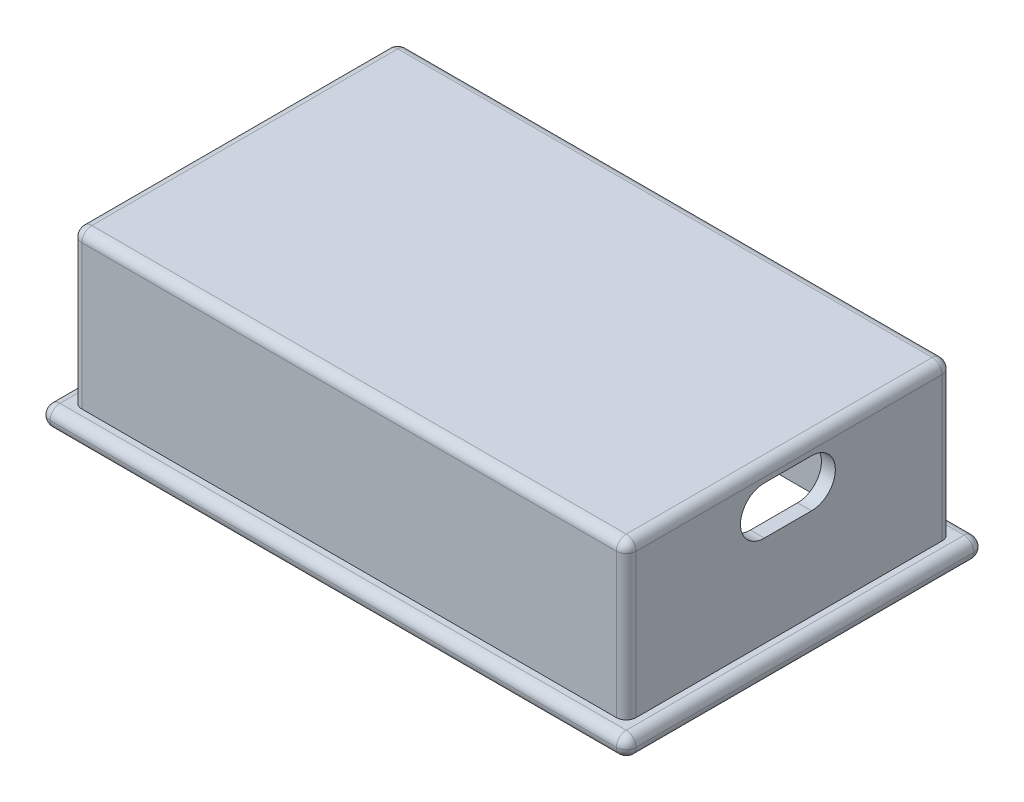
ISO-10303-21;
HEADER;
FILE_DESCRIPTION(('STEP AP214'),'2;1');
FILE_NAME('part.step','',(''),(''),'','','');
FILE_SCHEMA(('AUTOMOTIVE_DESIGN { 1 0 10303 214 1 1 1 1 }'));
ENDSEC;
DATA;
#1=APPLICATION_CONTEXT('core data for automotive mechanical design processes');
#2=APPLICATION_PROTOCOL_DEFINITION('international standard','automotive_design',2000,#1);
#3=PRODUCT_CONTEXT('',#1,'mechanical');
#4=PRODUCT('Part','Part','',(#3));
#5=PRODUCT_RELATED_PRODUCT_CATEGORY('part','',(#4));
#6=PRODUCT_DEFINITION_FORMATION('','',#4);
#7=PRODUCT_DEFINITION_CONTEXT('part definition',#1,'design');
#8=PRODUCT_DEFINITION('design','',#6,#7);
#9=PRODUCT_DEFINITION_SHAPE('','',#8);
#10=(LENGTH_UNIT() NAMED_UNIT(*) SI_UNIT(.MILLI.,.METRE.));
#11=(NAMED_UNIT(*) PLANE_ANGLE_UNIT() SI_UNIT($,.RADIAN.));
#12=(NAMED_UNIT(*) SI_UNIT($,.STERADIAN.) SOLID_ANGLE_UNIT());
#13=UNCERTAINTY_MEASURE_WITH_UNIT(LENGTH_MEASURE(1.E-05),#10,'distance_accuracy_value','');
#14=(GEOMETRIC_REPRESENTATION_CONTEXT(3) GLOBAL_UNCERTAINTY_ASSIGNED_CONTEXT((#13)) GLOBAL_UNIT_ASSIGNED_CONTEXT((#10,
#11,#12)) REPRESENTATION_CONTEXT('',''));
#15=CARTESIAN_POINT('',(0.,0.,0.));
#16=DIRECTION('',(0.,0.,1.));
#17=DIRECTION('',(1.,0.,0.));
#18=AXIS2_PLACEMENT_3D('',#15,#16,#17);
#19=CARTESIAN_POINT('',(0.,0.,0.));
#20=DIRECTION('',(0.,1.,0.));
#21=DIRECTION('',(0.,0.,1.));
#22=AXIS2_PLACEMENT_3D('',#19,#20,#21);
#23=PLANE('',#22);
#24=DIRECTION('',(1.,0.,0.));
#25=VECTOR('',#24,1.);
#26=CARTESIAN_POINT('',(0.,0.,17.));
#27=LINE('',#26,#25);
#28=CARTESIAN_POINT('',(28.5,0.,17.));
#29=VERTEX_POINT('',#28);
#30=CARTESIAN_POINT('',(-28.5,0.,17.));
#31=VERTEX_POINT('',#30);
#32=EDGE_CURVE('E401',#29,#31,#27,.F.);
#33=ORIENTED_EDGE('',*,*,#32,.T.);
#34=DIRECTION('',(0.,0.,1.));
#35=VECTOR('',#34,1.);
#36=CARTESIAN_POINT('',(-28.5,0.,0.));
#37=LINE('',#36,#35);
#38=CARTESIAN_POINT('',(-28.5,0.,-17.));
#39=VERTEX_POINT('',#38);
#40=EDGE_CURVE('E394',#31,#39,#37,.F.);
#41=ORIENTED_EDGE('',*,*,#40,.T.);
#42=DIRECTION('',(-1.,0.,0.));
#43=VECTOR('',#42,1.);
#44=CARTESIAN_POINT('',(0.,0.,-17.));
#45=LINE('',#44,#43);
#46=CARTESIAN_POINT('',(28.5,0.,-17.));
#47=VERTEX_POINT('',#46);
#48=EDGE_CURVE('E397',#39,#47,#45,.F.);
#49=ORIENTED_EDGE('',*,*,#48,.T.);
#50=DIRECTION('',(0.,0.,-1.));
#51=VECTOR('',#50,1.);
#52=CARTESIAN_POINT('',(28.5,0.,0.));
#53=LINE('',#52,#51);
#54=EDGE_CURVE('E399',#47,#29,#53,.F.);
#55=ORIENTED_EDGE('',*,*,#54,.T.);
#56=EDGE_LOOP('',(#33,#41,#49,#55));
#57=FACE_BOUND('',#56,.T.);
#58=DIRECTION('',(1.,0.,0.));
#59=VECTOR('',#58,1.);
#60=CARTESIAN_POINT('',(26.5,0.,-15.));
#61=LINE('',#60,#59);
#62=CARTESIAN_POINT('',(-26.5,0.,-15.));
#63=VERTEX_POINT('',#62);
#64=CARTESIAN_POINT('',(26.5,0.,-15.));
#65=VERTEX_POINT('',#64);
#66=EDGE_CURVE('E420',#63,#65,#61,.T.);
#67=ORIENTED_EDGE('',*,*,#66,.F.);
#68=DIRECTION('',(0.,0.,-1.));
#69=VECTOR('',#68,1.);
#70=CARTESIAN_POINT('',(-26.5,0.,-15.));
#71=LINE('',#70,#69);
#72=CARTESIAN_POINT('',(-26.5,0.,15.));
#73=VERTEX_POINT('',#72);
#74=EDGE_CURVE('E423',#73,#63,#71,.T.);
#75=ORIENTED_EDGE('',*,*,#74,.F.);
#76=DIRECTION('',(-1.,0.,0.));
#77=VECTOR('',#76,1.);
#78=CARTESIAN_POINT('',(26.5,0.,15.));
#79=LINE('',#78,#77);
#80=CARTESIAN_POINT('',(26.5,0.,15.));
#81=VERTEX_POINT('',#80);
#82=EDGE_CURVE('E413',#81,#73,#79,.T.);
#83=ORIENTED_EDGE('',*,*,#82,.F.);
#84=DIRECTION('',(0.,0.,1.));
#85=VECTOR('',#84,1.);
#86=CARTESIAN_POINT('',(26.5,0.,-15.));
#87=LINE('',#86,#85);
#88=EDGE_CURVE('E417',#65,#81,#87,.T.);
#89=ORIENTED_EDGE('',*,*,#88,.F.);
#90=EDGE_LOOP('',(#67,#75,#83,#89));
#91=FACE_BOUND('',#90,.T.);
#92=ADVANCED_FACE('F39',(#57,#91),#23,.F.);
#93=CARTESIAN_POINT('',(-26.5,15.9,-15.));
#94=DIRECTION('',(-1.,0.,0.));
#95=DIRECTION('',(0.,0.,1.));
#96=AXIS2_PLACEMENT_3D('',#93,#94,#95);
#97=PLANE('',#96);
#98=ORIENTED_EDGE('',*,*,#74,.T.);
#99=DIRECTION('',(0.,-1.,0.));
#100=VECTOR('',#99,1.);
#101=CARTESIAN_POINT('',(-26.5,15.9,-15.));
#102=LINE('',#101,#100);
#103=CARTESIAN_POINT('',(-26.5,15.9,-15.));
#104=VERTEX_POINT('',#103);
#105=EDGE_CURVE('E404',#104,#63,#102,.T.);
#106=ORIENTED_EDGE('',*,*,#105,.F.);
#107=DIRECTION('',(0.,0.,-1.));
#108=VECTOR('',#107,1.);
#109=CARTESIAN_POINT('',(-26.5,15.9,-15.));
#110=LINE('',#109,#108);
#111=CARTESIAN_POINT('',(-26.5,15.9,15.));
#112=VERTEX_POINT('',#111);
#113=EDGE_CURVE('E416',#112,#104,#110,.T.);
#114=ORIENTED_EDGE('',*,*,#113,.F.);
#115=DIRECTION('',(0.,-1.,0.));
#116=VECTOR('',#115,1.);
#117=CARTESIAN_POINT('',(-26.5,15.9,15.));
#118=LINE('',#117,#116);
#119=EDGE_CURVE('E403',#112,#73,#118,.T.);
#120=ORIENTED_EDGE('',*,*,#119,.T.);
#121=EDGE_LOOP('',(#98,#106,#114,#120));
#122=FACE_BOUND('',#121,.T.);
#123=ADVANCED_FACE('F561',(#122),#97,.F.);
#124=CARTESIAN_POINT('',(26.5,15.9,15.));
#125=DIRECTION('',(0.,0.,1.));
#126=DIRECTION('',(1.,0.,0.));
#127=AXIS2_PLACEMENT_3D('',#124,#125,#126);
#128=PLANE('',#127);
#129=ORIENTED_EDGE('',*,*,#82,.T.);
#130=ORIENTED_EDGE('',*,*,#119,.F.);
#131=DIRECTION('',(-1.,0.,0.));
#132=VECTOR('',#131,1.);
#133=CARTESIAN_POINT('',(26.5,15.9,15.));
#134=LINE('',#133,#132);
#135=CARTESIAN_POINT('',(26.5,15.9,15.));
#136=VERTEX_POINT('',#135);
#137=EDGE_CURVE('E408',#136,#112,#134,.T.);
#138=ORIENTED_EDGE('',*,*,#137,.F.);
#139=DIRECTION('',(0.,-1.,0.));
#140=VECTOR('',#139,1.);
#141=CARTESIAN_POINT('',(26.5,15.9,15.));
#142=LINE('',#141,#140);
#143=EDGE_CURVE('E410',#136,#81,#142,.T.);
#144=ORIENTED_EDGE('',*,*,#143,.T.);
#145=EDGE_LOOP('',(#129,#130,#138,#144));
#146=FACE_BOUND('',#145,.T.);
#147=ADVANCED_FACE('F567',(#146),#128,.F.);
#148=CARTESIAN_POINT('',(26.5,15.9,-15.));
#149=DIRECTION('',(1.,0.,0.));
#150=DIRECTION('',(0.,0.,-1.));
#151=AXIS2_PLACEMENT_3D('',#148,#149,#150);
#152=PLANE('',#151);
#153=DIRECTION('',(0.,0.,1.));
#154=VECTOR('',#153,1.);
#155=CARTESIAN_POINT('',(26.5,15.9,-15.));
#156=LINE('',#155,#154);
#157=CARTESIAN_POINT('',(26.5,15.9,3.18556546004011));
#158=VERTEX_POINT('',#157);
#159=EDGE_CURVE('E432',#158,#136,#156,.T.);
#160=ORIENTED_EDGE('',*,*,#159,.F.);
#161=CARTESIAN_POINT('',(26.5,13.6,2.5));
#162=DIRECTION('',(1.,0.,0.));
#163=DIRECTION('',(0.,0.,-1.));
#164=AXIS2_PLACEMENT_3D('',#161,#162,#163);
#165=CIRCLE('',#164,2.4);
#166=CARTESIAN_POINT('',(26.5,11.2,2.49999999999998));
#167=VERTEX_POINT('',#166);
#168=EDGE_CURVE('E449',#167,#158,#165,.F.);
#169=ORIENTED_EDGE('',*,*,#168,.F.);
#170=DIRECTION('',(0.,0.,1.));
#171=VECTOR('',#170,1.);
#172=CARTESIAN_POINT('',(26.5,11.2,-2.25000000000003));
#173=LINE('',#172,#171);
#174=CARTESIAN_POINT('',(26.5,11.2,-2.25000000000003));
#175=VERTEX_POINT('',#174);
#176=EDGE_CURVE('E447',#175,#167,#173,.T.);
#177=ORIENTED_EDGE('',*,*,#176,.F.);
#178=CARTESIAN_POINT('',(26.5,13.6,-2.25));
#179=DIRECTION('',(1.,0.,0.));
#180=DIRECTION('',(0.,0.,-1.));
#181=AXIS2_PLACEMENT_3D('',#178,#179,#180);
#182=CIRCLE('',#181,2.4);
#183=CARTESIAN_POINT('',(26.5,15.9,-2.9355654600401));
#184=VERTEX_POINT('',#183);
#185=EDGE_CURVE('E459',#184,#175,#182,.F.);
#186=ORIENTED_EDGE('',*,*,#185,.F.);
#187=CARTESIAN_POINT('',(26.5,15.9,-15.));
#188=VERTEX_POINT('',#187);
#189=EDGE_CURVE('E428',#188,#184,#156,.T.);
#190=ORIENTED_EDGE('',*,*,#189,.F.);
#191=DIRECTION('',(0.,-1.,0.));
#192=VECTOR('',#191,1.);
#193=CARTESIAN_POINT('',(26.5,15.9,-15.));
#194=LINE('',#193,#192);
#195=EDGE_CURVE('E407',#188,#65,#194,.T.);
#196=ORIENTED_EDGE('',*,*,#195,.T.);
#197=ORIENTED_EDGE('',*,*,#88,.T.);
#198=ORIENTED_EDGE('',*,*,#143,.F.);
#199=EDGE_LOOP('',(#160,#169,#177,#186,#190,#196,#197,#198));
#200=FACE_BOUND('',#199,.T.);
#201=ADVANCED_FACE('F487',(#200),#152,.F.);
#202=CARTESIAN_POINT('',(26.5,15.9,-15.));
#203=DIRECTION('',(0.,0.,-1.));
#204=DIRECTION('',(-1.,0.,0.));
#205=AXIS2_PLACEMENT_3D('',#202,#203,#204);
#206=PLANE('',#205);
#207=ORIENTED_EDGE('',*,*,#66,.T.);
#208=ORIENTED_EDGE('',*,*,#195,.F.);
#209=DIRECTION('',(1.,0.,0.));
#210=VECTOR('',#209,1.);
#211=CARTESIAN_POINT('',(26.5,15.9,-15.));
#212=LINE('',#211,#210);
#213=EDGE_CURVE('E433',#104,#188,#212,.T.);
#214=ORIENTED_EDGE('',*,*,#213,.F.);
#215=ORIENTED_EDGE('',*,*,#105,.T.);
#216=EDGE_LOOP('',(#207,#208,#214,#215));
#217=FACE_BOUND('',#216,.T.);
#218=ADVANCED_FACE('F881',(#217),#206,.F.);
#219=CARTESIAN_POINT('',(0.,15.9,0.));
#220=DIRECTION('',(0.,-1.,0.));
#221=DIRECTION('',(0.,0.,-1.));
#222=AXIS2_PLACEMENT_3D('',#219,#220,#221);
#223=PLANE('',#222);
#224=ORIENTED_EDGE('',*,*,#113,.T.);
#225=ORIENTED_EDGE('',*,*,#213,.T.);
#226=ORIENTED_EDGE('',*,*,#189,.T.);
#227=EDGE_CURVE('E431',#184,#158,#156,.T.);
#228=ORIENTED_EDGE('',*,*,#227,.T.);
#229=ORIENTED_EDGE('',*,*,#159,.T.);
#230=ORIENTED_EDGE('',*,*,#137,.T.);
#231=EDGE_LOOP('',(#224,#225,#226,#228,#229,#230));
#232=FACE_BOUND('',#231,.T.);
#233=ADVANCED_FACE('F868',(#232),#223,.T.);
#234=CARTESIAN_POINT('',(0.,2.,0.));
#235=DIRECTION('',(0.,1.,0.));
#236=DIRECTION('',(0.,0.,1.));
#237=AXIS2_PLACEMENT_3D('',#234,#235,#236);
#238=PLANE('',#237);
#239=DIRECTION('',(-1.,0.,0.));
#240=VECTOR('',#239,1.);
#241=CARTESIAN_POINT('',(-29.5,2.,-17.));
#242=LINE('',#241,#240);
#243=CARTESIAN_POINT('',(28.5,2.,-17.));
#244=VERTEX_POINT('',#243);
#245=CARTESIAN_POINT('',(-28.5,2.,-17.));
#246=VERTEX_POINT('',#245);
#247=EDGE_CURVE('E388',#244,#246,#242,.T.);
#248=ORIENTED_EDGE('',*,*,#247,.T.);
#249=DIRECTION('',(0.,0.,1.));
#250=VECTOR('',#249,1.);
#251=CARTESIAN_POINT('',(-28.5,2.,18.));
#252=LINE('',#251,#250);
#253=CARTESIAN_POINT('',(-28.5,2.,17.));
#254=VERTEX_POINT('',#253);
#255=EDGE_CURVE('E385',#246,#254,#252,.T.);
#256=ORIENTED_EDGE('',*,*,#255,.T.);
#257=DIRECTION('',(1.,0.,0.));
#258=VECTOR('',#257,1.);
#259=CARTESIAN_POINT('',(29.5,2.,17.));
#260=LINE('',#259,#258);
#261=CARTESIAN_POINT('',(28.5,2.,17.));
#262=VERTEX_POINT('',#261);
#263=EDGE_CURVE('E392',#254,#262,#260,.T.);
#264=ORIENTED_EDGE('',*,*,#263,.T.);
#265=DIRECTION('',(0.,0.,-1.));
#266=VECTOR('',#265,1.);
#267=CARTESIAN_POINT('',(28.5,2.,-18.));
#268=LINE('',#267,#266);
#269=EDGE_CURVE('E390',#262,#244,#268,.T.);
#270=ORIENTED_EDGE('',*,*,#269,.T.);
#271=EDGE_LOOP('',(#248,#256,#264,#270));
#272=FACE_BOUND('',#271,.T.);
#273=DIRECTION('',(-1.,0.,0.));
#274=VECTOR('',#273,1.);
#275=CARTESIAN_POINT('',(27.9,2.,-16.4));
#276=LINE('',#275,#274);
#277=CARTESIAN_POINT('',(26.9,2.,-16.4));
#278=VERTEX_POINT('',#277);
#279=CARTESIAN_POINT('',(-26.9,2.,-16.4));
#280=VERTEX_POINT('',#279);
#281=EDGE_CURVE('E425',#278,#280,#276,.T.);
#282=ORIENTED_EDGE('',*,*,#281,.F.);
#283=CARTESIAN_POINT('',(26.9,2.,-15.4));
#284=DIRECTION('',(0.,1.,0.));
#285=DIRECTION('',(0.,0.,1.));
#286=AXIS2_PLACEMENT_3D('',#283,#284,#285);
#287=CIRCLE('',#286,1.);
#288=CARTESIAN_POINT('',(27.9,2.,-15.4));
#289=VERTEX_POINT('',#288);
#290=EDGE_CURVE('E357',#278,#289,#287,.F.);
#291=ORIENTED_EDGE('',*,*,#290,.T.);
#292=DIRECTION('',(0.,0.,-1.));
#293=VECTOR('',#292,1.);
#294=CARTESIAN_POINT('',(27.9,2.,16.4));
#295=LINE('',#294,#293);
#296=CARTESIAN_POINT('',(27.9,2.,15.4));
#297=VERTEX_POINT('',#296);
#298=EDGE_CURVE('E440',#297,#289,#295,.T.);
#299=ORIENTED_EDGE('',*,*,#298,.F.);
#300=CARTESIAN_POINT('',(26.9,2.,15.4));
#301=DIRECTION('',(0.,1.,0.));
#302=DIRECTION('',(0.,0.,1.));
#303=AXIS2_PLACEMENT_3D('',#300,#301,#302);
#304=CIRCLE('',#303,1.);
#305=CARTESIAN_POINT('',(26.9,2.,16.4));
#306=VERTEX_POINT('',#305);
#307=EDGE_CURVE('E355',#297,#306,#304,.F.);
#308=ORIENTED_EDGE('',*,*,#307,.T.);
#309=DIRECTION('',(1.,0.,0.));
#310=VECTOR('',#309,1.);
#311=CARTESIAN_POINT('',(27.9,2.,16.4));
#312=LINE('',#311,#310);
#313=CARTESIAN_POINT('',(-26.9,2.,16.4));
#314=VERTEX_POINT('',#313);
#315=EDGE_CURVE('E237',#314,#306,#312,.T.);
#316=ORIENTED_EDGE('',*,*,#315,.F.);
#317=CARTESIAN_POINT('',(-26.9,2.,15.4));
#318=DIRECTION('',(0.,1.,0.));
#319=DIRECTION('',(0.,0.,1.));
#320=AXIS2_PLACEMENT_3D('',#317,#318,#319);
#321=CIRCLE('',#320,1.);
#322=CARTESIAN_POINT('',(-27.9,2.,15.4));
#323=VERTEX_POINT('',#322);
#324=EDGE_CURVE('E12',#314,#323,#321,.F.);
#325=ORIENTED_EDGE('',*,*,#324,.T.);
#326=DIRECTION('',(0.,0.,1.));
#327=VECTOR('',#326,1.);
#328=CARTESIAN_POINT('',(-27.9,2.,16.4));
#329=LINE('',#328,#327);
#330=CARTESIAN_POINT('',(-27.9,2.,-15.4));
#331=VERTEX_POINT('',#330);
#332=EDGE_CURVE('E444',#331,#323,#329,.T.);
#333=ORIENTED_EDGE('',*,*,#332,.F.);
#334=CARTESIAN_POINT('',(-26.9,2.,-15.4));
#335=DIRECTION('',(0.,1.,0.));
#336=DIRECTION('',(0.,0.,1.));
#337=AXIS2_PLACEMENT_3D('',#334,#335,#336);
#338=CIRCLE('',#337,1.);
#339=EDGE_CURVE('E49',#331,#280,#338,.F.);
#340=ORIENTED_EDGE('',*,*,#339,.T.);
#341=EDGE_LOOP('',(#282,#291,#299,#308,#316,#325,#333,#340));
#342=FACE_BOUND('',#341,.T.);
#343=ADVANCED_FACE('F546',(#272,#342),#238,.T.);
#344=CARTESIAN_POINT('',(-27.9,2.,16.4));
#345=DIRECTION('',(-1.,0.,0.));
#346=DIRECTION('',(0.,0.,1.));
#347=AXIS2_PLACEMENT_3D('',#344,#345,#346);
#348=PLANE('',#347);
#349=DIRECTION('',(0.,0.,1.));
#350=VECTOR('',#349,1.);
#351=CARTESIAN_POINT('',(-27.9,16.5,16.4));
#352=LINE('',#351,#350);
#353=CARTESIAN_POINT('',(-27.9,16.5,15.4));
#354=VERTEX_POINT('',#353);
#355=CARTESIAN_POINT('',(-27.9,16.5,-15.4));
#356=VERTEX_POINT('',#355);
#357=EDGE_CURVE('E58',#354,#356,#352,.F.);
#358=ORIENTED_EDGE('',*,*,#357,.T.);
#359=DIRECTION('',(0.,1.,0.));
#360=VECTOR('',#359,1.);
#361=CARTESIAN_POINT('',(-27.9,2.,-15.4));
#362=LINE('',#361,#360);
#363=EDGE_CURVE('E359',#356,#331,#362,.F.);
#364=ORIENTED_EDGE('',*,*,#363,.T.);
#365=ORIENTED_EDGE('',*,*,#332,.T.);
#366=DIRECTION('',(0.,1.,0.));
#367=VECTOR('',#366,1.);
#368=CARTESIAN_POINT('',(-27.9,2.,15.4));
#369=LINE('',#368,#367);
#370=EDGE_CURVE('E241',#323,#354,#369,.T.);
#371=ORIENTED_EDGE('',*,*,#370,.T.);
#372=EDGE_LOOP('',(#358,#364,#365,#371));
#373=FACE_BOUND('',#372,.T.);
#374=ADVANCED_FACE('F550',(#373),#348,.T.);
#375=CARTESIAN_POINT('',(27.9,2.,-16.4));
#376=DIRECTION('',(0.,0.,-1.));
#377=DIRECTION('',(-1.,0.,0.));
#378=AXIS2_PLACEMENT_3D('',#375,#376,#377);
#379=PLANE('',#378);
#380=DIRECTION('',(-1.,0.,0.));
#381=VECTOR('',#380,1.);
#382=CARTESIAN_POINT('',(27.9,16.5,-16.4));
#383=LINE('',#382,#381);
#384=CARTESIAN_POINT('',(-26.9,16.5,-16.4));
#385=VERTEX_POINT('',#384);
#386=CARTESIAN_POINT('',(26.9,16.5,-16.4));
#387=VERTEX_POINT('',#386);
#388=EDGE_CURVE('E371',#385,#387,#383,.F.);
#389=ORIENTED_EDGE('',*,*,#388,.T.);
#390=DIRECTION('',(0.,1.,0.));
#391=VECTOR('',#390,1.);
#392=CARTESIAN_POINT('',(26.9,2.,-16.4));
#393=LINE('',#392,#391);
#394=EDGE_CURVE('E369',#387,#278,#393,.F.);
#395=ORIENTED_EDGE('',*,*,#394,.T.);
#396=ORIENTED_EDGE('',*,*,#281,.T.);
#397=DIRECTION('',(0.,1.,0.));
#398=VECTOR('',#397,1.);
#399=CARTESIAN_POINT('',(-26.9,2.,-16.4));
#400=LINE('',#399,#398);
#401=EDGE_CURVE('E374',#280,#385,#400,.T.);
#402=ORIENTED_EDGE('',*,*,#401,.T.);
#403=EDGE_LOOP('',(#389,#395,#396,#402));
#404=FACE_BOUND('',#403,.T.);
#405=ADVANCED_FACE('F505',(#404),#379,.T.);
#406=CARTESIAN_POINT('',(27.9,2.,16.4));
#407=DIRECTION('',(1.,0.,0.));
#408=DIRECTION('',(0.,0.,-1.));
#409=AXIS2_PLACEMENT_3D('',#406,#407,#408);
#410=PLANE('',#409);
#411=CARTESIAN_POINT('',(27.9,13.6,2.5));
#412=DIRECTION('',(1.,0.,0.));
#413=DIRECTION('',(0.,0.,-1.));
#414=AXIS2_PLACEMENT_3D('',#411,#412,#413);
#415=CIRCLE('',#414,2.4);
#416=CARTESIAN_POINT('',(27.9,16.,2.5));
#417=VERTEX_POINT('',#416);
#418=CARTESIAN_POINT('',(27.9,11.2,2.49999999999998));
#419=VERTEX_POINT('',#418);
#420=EDGE_CURVE('E292',#417,#419,#415,.T.);
#421=ORIENTED_EDGE('',*,*,#420,.F.);
#422=DIRECTION('',(0.,0.,1.));
#423=VECTOR('',#422,1.);
#424=CARTESIAN_POINT('',(27.9,16.,-2.25));
#425=LINE('',#424,#423);
#426=CARTESIAN_POINT('',(27.9,16.,-2.25));
#427=VERTEX_POINT('',#426);
#428=EDGE_CURVE('E453',#427,#417,#425,.T.);
#429=ORIENTED_EDGE('',*,*,#428,.F.);
#430=CARTESIAN_POINT('',(27.9,13.6,-2.25));
#431=DIRECTION('',(1.,0.,0.));
#432=DIRECTION('',(0.,0.,-1.));
#433=AXIS2_PLACEMENT_3D('',#430,#431,#432);
#434=CIRCLE('',#433,2.4);
#435=CARTESIAN_POINT('',(27.9,11.2,-2.25000000000003));
#436=VERTEX_POINT('',#435);
#437=EDGE_CURVE('E462',#436,#427,#434,.T.);
#438=ORIENTED_EDGE('',*,*,#437,.F.);
#439=DIRECTION('',(0.,0.,-1.));
#440=VECTOR('',#439,1.);
#441=CARTESIAN_POINT('',(27.9,11.2,-2.25000000000003));
#442=LINE('',#441,#440);
#443=EDGE_CURVE('E464',#419,#436,#442,.T.);
#444=ORIENTED_EDGE('',*,*,#443,.F.);
#445=EDGE_LOOP('',(#421,#429,#438,#444));
#446=FACE_BOUND('',#445,.T.);
#447=ORIENTED_EDGE('',*,*,#298,.T.);
#448=DIRECTION('',(0.,1.,0.));
#449=VECTOR('',#448,1.);
#450=CARTESIAN_POINT('',(27.9,2.,-15.4));
#451=LINE('',#450,#449);
#452=CARTESIAN_POINT('',(27.9,16.5,-15.4));
#453=VERTEX_POINT('',#452);
#454=EDGE_CURVE('E364',#289,#453,#451,.T.);
#455=ORIENTED_EDGE('',*,*,#454,.T.);
#456=DIRECTION('',(0.,0.,-1.));
#457=VECTOR('',#456,1.);
#458=CARTESIAN_POINT('',(27.9,16.5,16.4));
#459=LINE('',#458,#457);
#460=CARTESIAN_POINT('',(27.9,16.5,15.4));
#461=VERTEX_POINT('',#460);
#462=EDGE_CURVE('E366',#453,#461,#459,.F.);
#463=ORIENTED_EDGE('',*,*,#462,.T.);
#464=DIRECTION('',(0.,1.,0.));
#465=VECTOR('',#464,1.);
#466=CARTESIAN_POINT('',(27.9,2.,15.4));
#467=LINE('',#466,#465);
#468=EDGE_CURVE('E258',#461,#297,#467,.F.);
#469=ORIENTED_EDGE('',*,*,#468,.T.);
#470=EDGE_LOOP('',(#447,#455,#463,#469));
#471=FACE_BOUND('',#470,.T.);
#472=ADVANCED_FACE('F502',(#446,#471),#410,.T.);
#473=CARTESIAN_POINT('',(27.9,2.,16.4));
#474=DIRECTION('',(0.,0.,1.));
#475=DIRECTION('',(1.,0.,0.));
#476=AXIS2_PLACEMENT_3D('',#473,#474,#475);
#477=PLANE('',#476);
#478=ORIENTED_EDGE('',*,*,#315,.T.);
#479=DIRECTION('',(0.,1.,0.));
#480=VECTOR('',#479,1.);
#481=CARTESIAN_POINT('',(26.9,2.,16.4));
#482=LINE('',#481,#480);
#483=CARTESIAN_POINT('',(26.9,16.5,16.4));
#484=VERTEX_POINT('',#483);
#485=EDGE_CURVE('E231',#306,#484,#482,.T.);
#486=ORIENTED_EDGE('',*,*,#485,.T.);
#487=DIRECTION('',(1.,0.,0.));
#488=VECTOR('',#487,1.);
#489=CARTESIAN_POINT('',(27.9,16.5,16.4));
#490=LINE('',#489,#488);
#491=CARTESIAN_POINT('',(-26.9,16.5,16.4));
#492=VERTEX_POINT('',#491);
#493=EDGE_CURVE('E234',#484,#492,#490,.F.);
#494=ORIENTED_EDGE('',*,*,#493,.T.);
#495=DIRECTION('',(0.,1.,0.));
#496=VECTOR('',#495,1.);
#497=CARTESIAN_POINT('',(-26.9,2.,16.4));
#498=LINE('',#497,#496);
#499=EDGE_CURVE('E254',#492,#314,#498,.F.);
#500=ORIENTED_EDGE('',*,*,#499,.T.);
#501=EDGE_LOOP('',(#478,#486,#494,#500));
#502=FACE_BOUND('',#501,.T.);
#503=ADVANCED_FACE('F233',(#502),#477,.T.);
#504=CARTESIAN_POINT('',(0.,17.5,0.));
#505=DIRECTION('',(0.,1.,0.));
#506=DIRECTION('',(0.,0.,1.));
#507=AXIS2_PLACEMENT_3D('',#504,#505,#506);
#508=PLANE('',#507);
#509=DIRECTION('',(0.,0.,-1.));
#510=VECTOR('',#509,1.);
#511=CARTESIAN_POINT('',(26.9,17.5,0.));
#512=LINE('',#511,#510);
#513=CARTESIAN_POINT('',(26.9,17.5,15.4));
#514=VERTEX_POINT('',#513);
#515=CARTESIAN_POINT('',(26.9,17.5,-15.4));
#516=VERTEX_POINT('',#515);
#517=EDGE_CURVE('E379',#514,#516,#512,.T.);
#518=ORIENTED_EDGE('',*,*,#517,.T.);
#519=DIRECTION('',(-1.,0.,0.));
#520=VECTOR('',#519,1.);
#521=CARTESIAN_POINT('',(0.,17.5,-15.4));
#522=LINE('',#521,#520);
#523=CARTESIAN_POINT('',(-26.9,17.5,-15.4));
#524=VERTEX_POINT('',#523);
#525=EDGE_CURVE('E376',#516,#524,#522,.T.);
#526=ORIENTED_EDGE('',*,*,#525,.T.);
#527=DIRECTION('',(0.,0.,1.));
#528=VECTOR('',#527,1.);
#529=CARTESIAN_POINT('',(-26.9,17.5,0.));
#530=LINE('',#529,#528);
#531=CARTESIAN_POINT('',(-26.9,17.5,15.4));
#532=VERTEX_POINT('',#531);
#533=EDGE_CURVE('E383',#524,#532,#530,.T.);
#534=ORIENTED_EDGE('',*,*,#533,.T.);
#535=DIRECTION('',(1.,0.,0.));
#536=VECTOR('',#535,1.);
#537=CARTESIAN_POINT('',(0.,17.5,15.4));
#538=LINE('',#537,#536);
#539=EDGE_CURVE('E381',#532,#514,#538,.T.);
#540=ORIENTED_EDGE('',*,*,#539,.T.);
#541=EDGE_LOOP('',(#518,#526,#534,#540));
#542=FACE_BOUND('',#541,.T.);
#543=ADVANCED_FACE('F524',(#542),#508,.T.);
#544=CARTESIAN_POINT('',(15.8115716777442,13.6,2.5));
#545=DIRECTION('',(1.,0.,0.));
#546=DIRECTION('',(0.,0.,-1.));
#547=AXIS2_PLACEMENT_3D('',#544,#545,#546);
#548=CYLINDRICAL_SURFACE('',#547,2.4);
#549=ORIENTED_EDGE('',*,*,#168,.T.);
#550=CARTESIAN_POINT('',(26.5,16.,2.50000000000001));
#551=VERTEX_POINT('',#550);
#552=EDGE_CURVE('E468',#158,#551,#165,.F.);
#553=ORIENTED_EDGE('',*,*,#552,.T.);
#554=DIRECTION('',(1.,0.,0.));
#555=VECTOR('',#554,1.);
#556=CARTESIAN_POINT('',(15.8115716777442,16.,2.5));
#557=LINE('',#556,#555);
#558=EDGE_CURVE('E457',#551,#417,#557,.T.);
#559=ORIENTED_EDGE('',*,*,#558,.T.);
#560=ORIENTED_EDGE('',*,*,#420,.T.);
#561=DIRECTION('',(1.,0.,0.));
#562=VECTOR('',#561,1.);
#563=CARTESIAN_POINT('',(15.8115716777442,11.2,2.49999999999998));
#564=LINE('',#563,#562);
#565=EDGE_CURVE('E450',#167,#419,#564,.T.);
#566=ORIENTED_EDGE('',*,*,#565,.F.);
#567=EDGE_LOOP('',(#549,#553,#559,#560,#566));
#568=FACE_BOUND('',#567,.T.);
#569=ADVANCED_FACE('F492',(#568),#548,.F.);
#570=CARTESIAN_POINT('',(15.8115716777442,16.,-2.25));
#571=DIRECTION('',(0.,1.,0.));
#572=DIRECTION('',(0.,0.,1.));
#573=AXIS2_PLACEMENT_3D('',#570,#571,#572);
#574=PLANE('',#573);
#575=DIRECTION('',(0.,0.,-1.));
#576=VECTOR('',#575,1.);
#577=CARTESIAN_POINT('',(26.5,16.,-2.25));
#578=LINE('',#577,#576);
#579=CARTESIAN_POINT('',(26.5,16.,-2.25));
#580=VERTEX_POINT('',#579);
#581=EDGE_CURVE('E469',#551,#580,#578,.T.);
#582=ORIENTED_EDGE('',*,*,#581,.T.);
#583=DIRECTION('',(1.,0.,0.));
#584=VECTOR('',#583,1.);
#585=CARTESIAN_POINT('',(15.8115716777442,16.,-2.25));
#586=LINE('',#585,#584);
#587=EDGE_CURVE('E455',#580,#427,#586,.T.);
#588=ORIENTED_EDGE('',*,*,#587,.T.);
#589=ORIENTED_EDGE('',*,*,#428,.T.);
#590=ORIENTED_EDGE('',*,*,#558,.F.);
#591=EDGE_LOOP('',(#582,#588,#589,#590));
#592=FACE_BOUND('',#591,.T.);
#593=ADVANCED_FACE('F498',(#592),#574,.F.);
#594=CARTESIAN_POINT('',(15.8115716777442,13.6,-2.25));
#595=DIRECTION('',(1.,0.,0.));
#596=DIRECTION('',(0.,0.,-1.));
#597=AXIS2_PLACEMENT_3D('',#594,#595,#596);
#598=CYLINDRICAL_SURFACE('',#597,2.4);
#599=EDGE_CURVE('E471',#580,#184,#182,.F.);
#600=ORIENTED_EDGE('',*,*,#599,.T.);
#601=ORIENTED_EDGE('',*,*,#185,.T.);
#602=DIRECTION('',(1.,0.,0.));
#603=VECTOR('',#602,1.);
#604=CARTESIAN_POINT('',(15.8115716777442,11.2,-2.25000000000003));
#605=LINE('',#604,#603);
#606=EDGE_CURVE('E103',#175,#436,#605,.T.);
#607=ORIENTED_EDGE('',*,*,#606,.T.);
#608=ORIENTED_EDGE('',*,*,#437,.T.);
#609=ORIENTED_EDGE('',*,*,#587,.F.);
#610=EDGE_LOOP('',(#600,#601,#607,#608,#609));
#611=FACE_BOUND('',#610,.T.);
#612=ADVANCED_FACE('F476',(#611),#598,.F.);
#613=CARTESIAN_POINT('',(15.8115716777442,11.2,-2.25000000000003));
#614=DIRECTION('',(0.,-1.,0.));
#615=DIRECTION('',(0.,0.,-1.));
#616=AXIS2_PLACEMENT_3D('',#613,#614,#615);
#617=PLANE('',#616);
#618=ORIENTED_EDGE('',*,*,#176,.T.);
#619=ORIENTED_EDGE('',*,*,#565,.T.);
#620=ORIENTED_EDGE('',*,*,#443,.T.);
#621=ORIENTED_EDGE('',*,*,#606,.F.);
#622=EDGE_LOOP('',(#618,#619,#620,#621));
#623=FACE_BOUND('',#622,.T.);
#624=ADVANCED_FACE('F481',(#623),#617,.F.);
#625=CARTESIAN_POINT('',(26.5,15.9,-15.));
#626=DIRECTION('',(1.,0.,0.));
#627=DIRECTION('',(0.,0.,-1.));
#628=AXIS2_PLACEMENT_3D('',#625,#626,#627);
#629=PLANE('',#628);
#630=ORIENTED_EDGE('',*,*,#599,.F.);
#631=ORIENTED_EDGE('',*,*,#581,.F.);
#632=ORIENTED_EDGE('',*,*,#552,.F.);
#633=ORIENTED_EDGE('',*,*,#227,.F.);
#634=EDGE_LOOP('',(#630,#631,#632,#633));
#635=FACE_BOUND('',#634,.T.);
#636=ADVANCED_FACE('F495',(#635),#629,.T.);
#637=CARTESIAN_POINT('',(28.5,1.,0.));
#638=DIRECTION('',(0.,0.,1.));
#639=DIRECTION('',(1.,0.,0.));
#640=AXIS2_PLACEMENT_3D('',#637,#638,#639);
#641=CYLINDRICAL_SURFACE('',#640,1.);
#642=DIRECTION('',(0.,0.,-1.));
#643=VECTOR('',#642,1.);
#644=CARTESIAN_POINT('',(29.5,1.,18.));
#645=LINE('',#644,#643);
#646=CARTESIAN_POINT('',(29.5,1.,-17.));
#647=VERTEX_POINT('',#646);
#648=CARTESIAN_POINT('',(29.5,1.,17.));
#649=VERTEX_POINT('',#648);
#650=EDGE_CURVE('E297',#647,#649,#645,.F.);
#651=ORIENTED_EDGE('',*,*,#650,.F.);
#652=CARTESIAN_POINT('',(28.5,1.,-17.));
#653=DIRECTION('',(0.,0.,-1.));
#654=DIRECTION('',(-1.,0.,0.));
#655=AXIS2_PLACEMENT_3D('',#652,#653,#654);
#656=CIRCLE('',#655,1.);
#657=EDGE_CURVE('E289',#244,#647,#656,.T.);
#658=ORIENTED_EDGE('',*,*,#657,.F.);
#659=ORIENTED_EDGE('',*,*,#269,.F.);
#660=CARTESIAN_POINT('',(28.5,1.,17.));
#661=DIRECTION('',(0.,0.,1.));
#662=DIRECTION('',(1.,0.,0.));
#663=AXIS2_PLACEMENT_3D('',#660,#661,#662);
#664=CIRCLE('',#663,1.);
#665=EDGE_CURVE('E87',#649,#262,#664,.T.);
#666=ORIENTED_EDGE('',*,*,#665,.F.);
#667=EDGE_LOOP('',(#651,#658,#659,#666));
#668=FACE_BOUND('',#667,.T.);
#669=ADVANCED_FACE('F631',(#668),#641,.T.);
#670=CARTESIAN_POINT('',(28.5,1.,-17.));
#671=DIRECTION('',(1.,0.,0.));
#672=DIRECTION('',(0.,0.,-1.));
#673=AXIS2_PLACEMENT_3D('',#670,#671,#672);
#674=SPHERICAL_SURFACE('',#673,1.);
#675=ORIENTED_EDGE('',*,*,#657,.T.);
#676=CARTESIAN_POINT('',(28.5,1.,-17.));
#677=DIRECTION('',(0.,-1.,0.));
#678=DIRECTION('',(0.,0.,-1.));
#679=AXIS2_PLACEMENT_3D('',#676,#677,#678);
#680=CIRCLE('',#679,1.);
#681=CARTESIAN_POINT('',(28.5,1.,-18.));
#682=VERTEX_POINT('',#681);
#683=EDGE_CURVE('E94',#682,#647,#680,.T.);
#684=ORIENTED_EDGE('',*,*,#683,.F.);
#685=CARTESIAN_POINT('',(28.5,1.,-17.));
#686=DIRECTION('',(1.,0.,0.));
#687=DIRECTION('',(0.,0.,-1.));
#688=AXIS2_PLACEMENT_3D('',#685,#686,#687);
#689=CIRCLE('',#688,1.);
#690=EDGE_CURVE('E303',#244,#682,#689,.F.);
#691=ORIENTED_EDGE('',*,*,#690,.F.);
#692=EDGE_LOOP('',(#675,#684,#691));
#693=FACE_BOUND('',#692,.T.);
#694=ADVANCED_FACE('F627',(#693),#674,.T.);
#695=CARTESIAN_POINT('',(28.5,1.,17.));
#696=DIRECTION('',(1.,0.,0.));
#697=DIRECTION('',(0.,0.,-1.));
#698=AXIS2_PLACEMENT_3D('',#695,#696,#697);
#699=SPHERICAL_SURFACE('',#698,1.);
#700=CARTESIAN_POINT('',(28.5,1.,17.));
#701=DIRECTION('',(0.,1.,0.));
#702=DIRECTION('',(0.,0.,1.));
#703=AXIS2_PLACEMENT_3D('',#700,#701,#702);
#704=CIRCLE('',#703,1.);
#705=CARTESIAN_POINT('',(28.5,1.,18.));
#706=VERTEX_POINT('',#705);
#707=EDGE_CURVE('E294',#649,#706,#704,.F.);
#708=ORIENTED_EDGE('',*,*,#707,.F.);
#709=ORIENTED_EDGE('',*,*,#665,.T.);
#710=CARTESIAN_POINT('',(28.5,1.,17.));
#711=DIRECTION('',(1.,0.,0.));
#712=DIRECTION('',(0.,0.,-1.));
#713=AXIS2_PLACEMENT_3D('',#710,#711,#712);
#714=CIRCLE('',#713,1.);
#715=EDGE_CURVE('E306',#706,#262,#714,.F.);
#716=ORIENTED_EDGE('',*,*,#715,.F.);
#717=EDGE_LOOP('',(#708,#709,#716));
#718=FACE_BOUND('',#717,.T.);
#719=ADVANCED_FACE('F623',(#718),#699,.T.);
#720=CARTESIAN_POINT('',(28.5,1.,18.));
#721=DIRECTION('',(0.,0.,-1.));
#722=DIRECTION('',(-1.,0.,0.));
#723=AXIS2_PLACEMENT_3D('',#720,#721,#722);
#724=CYLINDRICAL_SURFACE('',#723,1.);
#725=CARTESIAN_POINT('',(28.5,1.,-17.));
#726=DIRECTION('',(0.,0.,-1.));
#727=DIRECTION('',(-1.,0.,0.));
#728=AXIS2_PLACEMENT_3D('',#725,#726,#727);
#729=CIRCLE('',#728,1.);
#730=EDGE_CURVE('E300',#647,#47,#729,.T.);
#731=ORIENTED_EDGE('',*,*,#730,.F.);
#732=ORIENTED_EDGE('',*,*,#650,.T.);
#733=CARTESIAN_POINT('',(28.5,1.,17.));
#734=DIRECTION('',(0.,0.,1.));
#735=DIRECTION('',(1.,0.,0.));
#736=AXIS2_PLACEMENT_3D('',#733,#734,#735);
#737=CIRCLE('',#736,1.);
#738=EDGE_CURVE('E309',#29,#649,#737,.T.);
#739=ORIENTED_EDGE('',*,*,#738,.F.);
#740=ORIENTED_EDGE('',*,*,#54,.F.);
#741=EDGE_LOOP('',(#731,#732,#739,#740));
#742=FACE_BOUND('',#741,.T.);
#743=ADVANCED_FACE('F620',(#742),#724,.T.);
#744=CARTESIAN_POINT('',(28.5,1.,-17.));
#745=DIRECTION('',(1.,0.,0.));
#746=DIRECTION('',(0.,1.,0.));
#747=AXIS2_PLACEMENT_3D('',#744,#745,#746);
#748=SPHERICAL_SURFACE('',#747,1.);
#749=ORIENTED_EDGE('',*,*,#683,.T.);
#750=ORIENTED_EDGE('',*,*,#730,.T.);
#751=CARTESIAN_POINT('',(28.5,1.,-17.));
#752=DIRECTION('',(1.,0.,0.));
#753=DIRECTION('',(0.,0.,-1.));
#754=AXIS2_PLACEMENT_3D('',#751,#752,#753);
#755=CIRCLE('',#754,1.);
#756=EDGE_CURVE('E312',#682,#47,#755,.F.);
#757=ORIENTED_EDGE('',*,*,#756,.F.);
#758=EDGE_LOOP('',(#749,#750,#757));
#759=FACE_BOUND('',#758,.T.);
#760=ADVANCED_FACE('F616',(#759),#748,.T.);
#761=CARTESIAN_POINT('',(0.,1.,-17.));
#762=DIRECTION('',(1.,0.,0.));
#763=DIRECTION('',(0.,0.,-1.));
#764=AXIS2_PLACEMENT_3D('',#761,#762,#763);
#765=CYLINDRICAL_SURFACE('',#764,1.);
#766=ORIENTED_EDGE('',*,*,#247,.F.);
#767=ORIENTED_EDGE('',*,*,#690,.T.);
#768=DIRECTION('',(-1.,0.,0.));
#769=VECTOR('',#768,1.);
#770=CARTESIAN_POINT('',(29.5,1.,-18.));
#771=LINE('',#770,#769);
#772=CARTESIAN_POINT('',(-28.5,1.,-18.));
#773=VERTEX_POINT('',#772);
#774=EDGE_CURVE('E315',#773,#682,#771,.F.);
#775=ORIENTED_EDGE('',*,*,#774,.F.);
#776=CARTESIAN_POINT('',(-28.5,1.,-17.));
#777=DIRECTION('',(-1.,0.,0.));
#778=DIRECTION('',(0.,0.,1.));
#779=AXIS2_PLACEMENT_3D('',#776,#777,#778);
#780=CIRCLE('',#779,1.);
#781=EDGE_CURVE('E318',#246,#773,#780,.T.);
#782=ORIENTED_EDGE('',*,*,#781,.F.);
#783=EDGE_LOOP('',(#766,#767,#775,#782));
#784=FACE_BOUND('',#783,.T.);
#785=ADVANCED_FACE('F612',(#784),#765,.T.);
#786=CARTESIAN_POINT('',(0.,1.,17.));
#787=DIRECTION('',(-1.,0.,0.));
#788=DIRECTION('',(0.,0.,1.));
#789=AXIS2_PLACEMENT_3D('',#786,#787,#788);
#790=CYLINDRICAL_SURFACE('',#789,1.);
#791=ORIENTED_EDGE('',*,*,#715,.T.);
#792=ORIENTED_EDGE('',*,*,#263,.F.);
#793=CARTESIAN_POINT('',(-28.5,1.,17.));
#794=DIRECTION('',(-1.,0.,0.));
#795=DIRECTION('',(0.,0.,1.));
#796=AXIS2_PLACEMENT_3D('',#793,#794,#795);
#797=CIRCLE('',#796,1.);
#798=CARTESIAN_POINT('',(-28.5,1.,18.));
#799=VERTEX_POINT('',#798);
#800=EDGE_CURVE('E321',#799,#254,#797,.T.);
#801=ORIENTED_EDGE('',*,*,#800,.F.);
#802=DIRECTION('',(1.,0.,0.));
#803=VECTOR('',#802,1.);
#804=CARTESIAN_POINT('',(-29.5,1.,18.));
#805=LINE('',#804,#803);
#806=EDGE_CURVE('E327',#706,#799,#805,.F.);
#807=ORIENTED_EDGE('',*,*,#806,.F.);
#808=EDGE_LOOP('',(#791,#792,#801,#807));
#809=FACE_BOUND('',#808,.T.);
#810=ADVANCED_FACE('F608',(#809),#790,.T.);
#811=CARTESIAN_POINT('',(28.5,1.,17.));
#812=DIRECTION('',(1.,0.,0.));
#813=DIRECTION('',(0.,1.,0.));
#814=AXIS2_PLACEMENT_3D('',#811,#812,#813);
#815=SPHERICAL_SURFACE('',#814,1.);
#816=ORIENTED_EDGE('',*,*,#738,.T.);
#817=ORIENTED_EDGE('',*,*,#707,.T.);
#818=CARTESIAN_POINT('',(28.5,1.,17.));
#819=DIRECTION('',(1.,0.,0.));
#820=DIRECTION('',(0.,0.,-1.));
#821=AXIS2_PLACEMENT_3D('',#818,#819,#820);
#822=CIRCLE('',#821,1.);
#823=EDGE_CURVE('E330',#29,#706,#822,.F.);
#824=ORIENTED_EDGE('',*,*,#823,.F.);
#825=EDGE_LOOP('',(#816,#817,#824));
#826=FACE_BOUND('',#825,.T.);
#827=ADVANCED_FACE('F604',(#826),#815,.T.);
#828=CARTESIAN_POINT('',(29.5,1.,-17.));
#829=DIRECTION('',(-1.,0.,0.));
#830=DIRECTION('',(0.,0.,1.));
#831=AXIS2_PLACEMENT_3D('',#828,#829,#830);
#832=CYLINDRICAL_SURFACE('',#831,1.);
#833=CARTESIAN_POINT('',(-28.5,1.,-17.));
#834=DIRECTION('',(-1.,0.,0.));
#835=DIRECTION('',(0.,0.,1.));
#836=AXIS2_PLACEMENT_3D('',#833,#834,#835);
#837=CIRCLE('',#836,1.);
#838=EDGE_CURVE('E333',#773,#39,#837,.T.);
#839=ORIENTED_EDGE('',*,*,#838,.F.);
#840=ORIENTED_EDGE('',*,*,#774,.T.);
#841=ORIENTED_EDGE('',*,*,#756,.T.);
#842=ORIENTED_EDGE('',*,*,#48,.F.);
#843=EDGE_LOOP('',(#839,#840,#841,#842));
#844=FACE_BOUND('',#843,.T.);
#845=ADVANCED_FACE('F600',(#844),#832,.T.);
#846=CARTESIAN_POINT('',(-28.5,1.,-17.));
#847=DIRECTION('',(0.,0.,-1.));
#848=DIRECTION('',(-1.,0.,0.));
#849=AXIS2_PLACEMENT_3D('',#846,#847,#848);
#850=SPHERICAL_SURFACE('',#849,1.);
#851=ORIENTED_EDGE('',*,*,#781,.T.);
#852=CARTESIAN_POINT('',(-28.5,1.,-17.));
#853=DIRECTION('',(0.,-1.,0.));
#854=DIRECTION('',(0.,0.,-1.));
#855=AXIS2_PLACEMENT_3D('',#852,#853,#854);
#856=CIRCLE('',#855,1.);
#857=CARTESIAN_POINT('',(-29.5,1.,-17.));
#858=VERTEX_POINT('',#857);
#859=EDGE_CURVE('E336',#858,#773,#856,.T.);
#860=ORIENTED_EDGE('',*,*,#859,.F.);
#861=CARTESIAN_POINT('',(-28.5,1.,-17.));
#862=DIRECTION('',(0.,0.,-1.));
#863=DIRECTION('',(-1.,0.,0.));
#864=AXIS2_PLACEMENT_3D('',#861,#862,#863);
#865=CIRCLE('',#864,1.);
#866=EDGE_CURVE('E339',#246,#858,#865,.F.);
#867=ORIENTED_EDGE('',*,*,#866,.F.);
#868=EDGE_LOOP('',(#851,#860,#867));
#869=FACE_BOUND('',#868,.T.);
#870=ADVANCED_FACE('F596',(#869),#850,.T.);
#871=CARTESIAN_POINT('',(-28.5,1.,17.));
#872=DIRECTION('',(0.,0.,1.));
#873=DIRECTION('',(1.,0.,0.));
#874=AXIS2_PLACEMENT_3D('',#871,#872,#873);
#875=SPHERICAL_SURFACE('',#874,1.);
#876=CARTESIAN_POINT('',(-28.5,1.,17.));
#877=DIRECTION('',(0.,1.,0.));
#878=DIRECTION('',(0.,0.,1.));
#879=AXIS2_PLACEMENT_3D('',#876,#877,#878);
#880=CIRCLE('',#879,1.);
#881=CARTESIAN_POINT('',(-29.5,1.,17.));
#882=VERTEX_POINT('',#881);
#883=EDGE_CURVE('E324',#799,#882,#880,.F.);
#884=ORIENTED_EDGE('',*,*,#883,.F.);
#885=ORIENTED_EDGE('',*,*,#800,.T.);
#886=CARTESIAN_POINT('',(-28.5,1.,17.));
#887=DIRECTION('',(0.,0.,1.));
#888=DIRECTION('',(1.,0.,0.));
#889=AXIS2_PLACEMENT_3D('',#886,#887,#888);
#890=CIRCLE('',#889,1.);
#891=EDGE_CURVE('E342',#882,#254,#890,.F.);
#892=ORIENTED_EDGE('',*,*,#891,.F.);
#893=EDGE_LOOP('',(#884,#885,#892));
#894=FACE_BOUND('',#893,.T.);
#895=ADVANCED_FACE('F592',(#894),#875,.T.);
#896=CARTESIAN_POINT('',(29.5,1.,17.));
#897=DIRECTION('',(1.,0.,0.));
#898=DIRECTION('',(0.,0.,-1.));
#899=AXIS2_PLACEMENT_3D('',#896,#897,#898);
#900=CYLINDRICAL_SURFACE('',#899,1.);
#901=ORIENTED_EDGE('',*,*,#823,.T.);
#902=ORIENTED_EDGE('',*,*,#806,.T.);
#903=CARTESIAN_POINT('',(-28.5,1.,17.));
#904=DIRECTION('',(-1.,0.,0.));
#905=DIRECTION('',(0.,0.,1.));
#906=AXIS2_PLACEMENT_3D('',#903,#904,#905);
#907=CIRCLE('',#906,1.);
#908=EDGE_CURVE('E344',#31,#799,#907,.T.);
#909=ORIENTED_EDGE('',*,*,#908,.F.);
#910=ORIENTED_EDGE('',*,*,#32,.F.);
#911=EDGE_LOOP('',(#901,#902,#909,#910));
#912=FACE_BOUND('',#911,.T.);
#913=ADVANCED_FACE('F588',(#912),#900,.T.);
#914=CARTESIAN_POINT('',(-28.5,1.,-17.));
#915=DIRECTION('',(0.,0.,-1.));
#916=DIRECTION('',(0.,1.,0.));
#917=AXIS2_PLACEMENT_3D('',#914,#915,#916);
#918=SPHERICAL_SURFACE('',#917,1.);
#919=ORIENTED_EDGE('',*,*,#859,.T.);
#920=ORIENTED_EDGE('',*,*,#838,.T.);
#921=CARTESIAN_POINT('',(-28.5,1.,-17.));
#922=DIRECTION('',(0.,0.,-1.));
#923=DIRECTION('',(-1.,0.,0.));
#924=AXIS2_PLACEMENT_3D('',#921,#922,#923);
#925=CIRCLE('',#924,1.);
#926=EDGE_CURVE('E347',#858,#39,#925,.F.);
#927=ORIENTED_EDGE('',*,*,#926,.F.);
#928=EDGE_LOOP('',(#919,#920,#927));
#929=FACE_BOUND('',#928,.T.);
#930=ADVANCED_FACE('F584',(#929),#918,.T.);
#931=CARTESIAN_POINT('',(-28.5,1.,0.));
#932=DIRECTION('',(0.,0.,-1.));
#933=DIRECTION('',(-1.,0.,0.));
#934=AXIS2_PLACEMENT_3D('',#931,#932,#933);
#935=CYLINDRICAL_SURFACE('',#934,1.);
#936=ORIENTED_EDGE('',*,*,#255,.F.);
#937=ORIENTED_EDGE('',*,*,#866,.T.);
#938=DIRECTION('',(0.,0.,1.));
#939=VECTOR('',#938,1.);
#940=CARTESIAN_POINT('',(-29.5,1.,-18.));
#941=LINE('',#940,#939);
#942=EDGE_CURVE('E349',#882,#858,#941,.F.);
#943=ORIENTED_EDGE('',*,*,#942,.F.);
#944=ORIENTED_EDGE('',*,*,#891,.T.);
#945=EDGE_LOOP('',(#936,#937,#943,#944));
#946=FACE_BOUND('',#945,.T.);
#947=ADVANCED_FACE('F580',(#946),#935,.T.);
#948=CARTESIAN_POINT('',(-28.5,1.,17.));
#949=DIRECTION('',(0.,0.,1.));
#950=DIRECTION('',(0.,-1.,0.));
#951=AXIS2_PLACEMENT_3D('',#948,#949,#950);
#952=SPHERICAL_SURFACE('',#951,1.);
#953=ORIENTED_EDGE('',*,*,#908,.T.);
#954=ORIENTED_EDGE('',*,*,#883,.T.);
#955=CARTESIAN_POINT('',(-28.5,1.,17.));
#956=DIRECTION('',(0.,0.,1.));
#957=DIRECTION('',(1.,0.,0.));
#958=AXIS2_PLACEMENT_3D('',#955,#956,#957);
#959=CIRCLE('',#958,1.);
#960=EDGE_CURVE('E261',#31,#882,#959,.F.);
#961=ORIENTED_EDGE('',*,*,#960,.F.);
#962=EDGE_LOOP('',(#953,#954,#961));
#963=FACE_BOUND('',#962,.T.);
#964=ADVANCED_FACE('F576',(#963),#952,.T.);
#965=CARTESIAN_POINT('',(-28.5,1.,18.));
#966=DIRECTION('',(0.,0.,1.));
#967=DIRECTION('',(1.,0.,0.));
#968=AXIS2_PLACEMENT_3D('',#965,#966,#967);
#969=CYLINDRICAL_SURFACE('',#968,1.);
#970=ORIENTED_EDGE('',*,*,#926,.T.);
#971=ORIENTED_EDGE('',*,*,#40,.F.);
#972=ORIENTED_EDGE('',*,*,#960,.T.);
#973=ORIENTED_EDGE('',*,*,#942,.T.);
#974=EDGE_LOOP('',(#970,#971,#972,#973));
#975=FACE_BOUND('',#974,.T.);
#976=ADVANCED_FACE('F573',(#975),#969,.T.);
#977=CARTESIAN_POINT('',(26.9,2.,15.4));
#978=DIRECTION('',(0.,1.,0.));
#979=DIRECTION('',(0.,0.,1.));
#980=AXIS2_PLACEMENT_3D('',#977,#978,#979);
#981=CYLINDRICAL_SURFACE('',#980,1.);
#982=ORIENTED_EDGE('',*,*,#307,.F.);
#983=ORIENTED_EDGE('',*,*,#468,.F.);
#984=CARTESIAN_POINT('',(26.9,16.5,15.4));
#985=DIRECTION('',(0.,1.,0.));
#986=DIRECTION('',(0.,0.,1.));
#987=AXIS2_PLACEMENT_3D('',#984,#985,#986);
#988=CIRCLE('',#987,1.);
#989=EDGE_CURVE('E43',#484,#461,#988,.T.);
#990=ORIENTED_EDGE('',*,*,#989,.F.);
#991=ORIENTED_EDGE('',*,*,#485,.F.);
#992=EDGE_LOOP('',(#982,#983,#990,#991));
#993=FACE_BOUND('',#992,.T.);
#994=ADVANCED_FACE('F41',(#993),#981,.T.);
#995=CARTESIAN_POINT('',(0.,16.5,15.4));
#996=DIRECTION('',(1.,0.,0.));
#997=DIRECTION('',(0.,0.,-1.));
#998=AXIS2_PLACEMENT_3D('',#995,#996,#997);
#999=CYLINDRICAL_SURFACE('',#998,1.);
#1000=CARTESIAN_POINT('',(-26.9,16.5,15.4));
#1001=DIRECTION('',(-1.,0.,0.));
#1002=DIRECTION('',(0.,0.,1.));
#1003=AXIS2_PLACEMENT_3D('',#1000,#1001,#1002);
#1004=CIRCLE('',#1003,1.);
#1005=EDGE_CURVE('E252',#492,#532,#1004,.T.);
#1006=ORIENTED_EDGE('',*,*,#1005,.F.);
#1007=ORIENTED_EDGE('',*,*,#493,.F.);
#1008=CARTESIAN_POINT('',(26.9,16.5,15.4));
#1009=DIRECTION('',(1.,0.,0.));
#1010=DIRECTION('',(0.,0.,-1.));
#1011=AXIS2_PLACEMENT_3D('',#1008,#1009,#1010);
#1012=CIRCLE('',#1011,1.);
#1013=EDGE_CURVE('E249',#514,#484,#1012,.T.);
#1014=ORIENTED_EDGE('',*,*,#1013,.F.);
#1015=ORIENTED_EDGE('',*,*,#539,.F.);
#1016=EDGE_LOOP('',(#1006,#1007,#1014,#1015));
#1017=FACE_BOUND('',#1016,.T.);
#1018=ADVANCED_FACE('F246',(#1017),#999,.T.);
#1019=CARTESIAN_POINT('',(-26.9,2.,15.4));
#1020=DIRECTION('',(0.,1.,0.));
#1021=DIRECTION('',(0.,0.,1.));
#1022=AXIS2_PLACEMENT_3D('',#1019,#1020,#1021);
#1023=CYLINDRICAL_SURFACE('',#1022,1.);
#1024=ORIENTED_EDGE('',*,*,#324,.F.);
#1025=ORIENTED_EDGE('',*,*,#499,.F.);
#1026=CARTESIAN_POINT('',(-26.9,16.5,15.4));
#1027=DIRECTION('',(0.,1.,0.));
#1028=DIRECTION('',(0.,0.,1.));
#1029=AXIS2_PLACEMENT_3D('',#1026,#1027,#1028);
#1030=CIRCLE('',#1029,1.);
#1031=EDGE_CURVE('E265',#354,#492,#1030,.T.);
#1032=ORIENTED_EDGE('',*,*,#1031,.F.);
#1033=ORIENTED_EDGE('',*,*,#370,.F.);
#1034=EDGE_LOOP('',(#1024,#1025,#1032,#1033));
#1035=FACE_BOUND('',#1034,.T.);
#1036=ADVANCED_FACE('F552',(#1035),#1023,.T.);
#1037=CARTESIAN_POINT('',(26.9,16.5,15.4));
#1038=DIRECTION('',(0.,0.,1.));
#1039=DIRECTION('',(1.,0.,0.));
#1040=AXIS2_PLACEMENT_3D('',#1037,#1038,#1039);
#1041=SPHERICAL_SURFACE('',#1040,1.);
#1042=ORIENTED_EDGE('',*,*,#1013,.T.);
#1043=ORIENTED_EDGE('',*,*,#989,.T.);
#1044=CARTESIAN_POINT('',(26.9,16.5,15.4));
#1045=DIRECTION('',(0.,0.,1.));
#1046=DIRECTION('',(1.,0.,0.));
#1047=AXIS2_PLACEMENT_3D('',#1044,#1045,#1046);
#1048=CIRCLE('',#1047,1.);
#1049=EDGE_CURVE('E263',#514,#461,#1048,.F.);
#1050=ORIENTED_EDGE('',*,*,#1049,.F.);
#1051=EDGE_LOOP('',(#1042,#1043,#1050));
#1052=FACE_BOUND('',#1051,.T.);
#1053=ADVANCED_FACE('F262',(#1052),#1041,.T.);
#1054=CARTESIAN_POINT('',(-26.9,16.5,15.4));
#1055=DIRECTION('',(0.,0.,1.));
#1056=DIRECTION('',(1.,0.,0.));
#1057=AXIS2_PLACEMENT_3D('',#1054,#1055,#1056);
#1058=SPHERICAL_SURFACE('',#1057,1.);
#1059=ORIENTED_EDGE('',*,*,#1031,.T.);
#1060=ORIENTED_EDGE('',*,*,#1005,.T.);
#1061=CARTESIAN_POINT('',(-26.9,16.5,15.4));
#1062=DIRECTION('',(0.,0.,1.));
#1063=DIRECTION('',(1.,0.,0.));
#1064=AXIS2_PLACEMENT_3D('',#1061,#1062,#1063);
#1065=CIRCLE('',#1064,1.);
#1066=EDGE_CURVE('E270',#354,#532,#1065,.F.);
#1067=ORIENTED_EDGE('',*,*,#1066,.F.);
#1068=EDGE_LOOP('',(#1059,#1060,#1067));
#1069=FACE_BOUND('',#1068,.T.);
#1070=ADVANCED_FACE('F528',(#1069),#1058,.T.);
#1071=CARTESIAN_POINT('',(26.9,2.,-15.4));
#1072=DIRECTION('',(0.,1.,0.));
#1073=DIRECTION('',(0.,0.,1.));
#1074=AXIS2_PLACEMENT_3D('',#1071,#1072,#1073);
#1075=CYLINDRICAL_SURFACE('',#1074,1.);
#1076=ORIENTED_EDGE('',*,*,#290,.F.);
#1077=ORIENTED_EDGE('',*,*,#394,.F.);
#1078=CARTESIAN_POINT('',(26.9,16.5,-15.4));
#1079=DIRECTION('',(0.,1.,0.));
#1080=DIRECTION('',(0.,0.,1.));
#1081=AXIS2_PLACEMENT_3D('',#1078,#1079,#1080);
#1082=CIRCLE('',#1081,1.);
#1083=EDGE_CURVE('E273',#453,#387,#1082,.T.);
#1084=ORIENTED_EDGE('',*,*,#1083,.F.);
#1085=ORIENTED_EDGE('',*,*,#454,.F.);
#1086=EDGE_LOOP('',(#1076,#1077,#1084,#1085));
#1087=FACE_BOUND('',#1086,.T.);
#1088=ADVANCED_FACE('F514',(#1087),#1075,.T.);
#1089=CARTESIAN_POINT('',(26.9,16.5,0.));
#1090=DIRECTION('',(0.,0.,-1.));
#1091=DIRECTION('',(-1.,0.,0.));
#1092=AXIS2_PLACEMENT_3D('',#1089,#1090,#1091);
#1093=CYLINDRICAL_SURFACE('',#1092,1.);
#1094=ORIENTED_EDGE('',*,*,#1049,.T.);
#1095=ORIENTED_EDGE('',*,*,#462,.F.);
#1096=CARTESIAN_POINT('',(26.9,16.5,-15.4));
#1097=DIRECTION('',(0.,0.,-1.));
#1098=DIRECTION('',(-1.,0.,0.));
#1099=AXIS2_PLACEMENT_3D('',#1096,#1097,#1098);
#1100=CIRCLE('',#1099,1.);
#1101=EDGE_CURVE('E276',#516,#453,#1100,.T.);
#1102=ORIENTED_EDGE('',*,*,#1101,.F.);
#1103=ORIENTED_EDGE('',*,*,#517,.F.);
#1104=EDGE_LOOP('',(#1094,#1095,#1102,#1103));
#1105=FACE_BOUND('',#1104,.T.);
#1106=ADVANCED_FACE('F522',(#1105),#1093,.T.);
#1107=CARTESIAN_POINT('',(-26.9,16.5,0.));
#1108=DIRECTION('',(0.,0.,1.));
#1109=DIRECTION('',(1.,0.,0.));
#1110=AXIS2_PLACEMENT_3D('',#1107,#1108,#1109);
#1111=CYLINDRICAL_SURFACE('',#1110,1.);
#1112=ORIENTED_EDGE('',*,*,#1066,.T.);
#1113=ORIENTED_EDGE('',*,*,#533,.F.);
#1114=CARTESIAN_POINT('',(-26.9,16.5,-15.4));
#1115=DIRECTION('',(0.,0.,-1.));
#1116=DIRECTION('',(-1.,0.,0.));
#1117=AXIS2_PLACEMENT_3D('',#1114,#1115,#1116);
#1118=CIRCLE('',#1117,1.);
#1119=EDGE_CURVE('E279',#356,#524,#1118,.T.);
#1120=ORIENTED_EDGE('',*,*,#1119,.F.);
#1121=ORIENTED_EDGE('',*,*,#357,.F.);
#1122=EDGE_LOOP('',(#1112,#1113,#1120,#1121));
#1123=FACE_BOUND('',#1122,.T.);
#1124=ADVANCED_FACE('F531',(#1123),#1111,.T.);
#1125=CARTESIAN_POINT('',(-26.9,2.,-15.4));
#1126=DIRECTION('',(0.,1.,0.));
#1127=DIRECTION('',(0.,0.,1.));
#1128=AXIS2_PLACEMENT_3D('',#1125,#1126,#1127);
#1129=CYLINDRICAL_SURFACE('',#1128,1.);
#1130=ORIENTED_EDGE('',*,*,#339,.F.);
#1131=ORIENTED_EDGE('',*,*,#363,.F.);
#1132=CARTESIAN_POINT('',(-26.9,16.5,-15.4));
#1133=DIRECTION('',(0.,1.,0.));
#1134=DIRECTION('',(0.,0.,1.));
#1135=AXIS2_PLACEMENT_3D('',#1132,#1133,#1134);
#1136=CIRCLE('',#1135,1.);
#1137=EDGE_CURVE('E282',#385,#356,#1136,.T.);
#1138=ORIENTED_EDGE('',*,*,#1137,.F.);
#1139=ORIENTED_EDGE('',*,*,#401,.F.);
#1140=EDGE_LOOP('',(#1130,#1131,#1138,#1139));
#1141=FACE_BOUND('',#1140,.T.);
#1142=ADVANCED_FACE('F541',(#1141),#1129,.T.);
#1143=CARTESIAN_POINT('',(26.9,16.5,-15.4));
#1144=DIRECTION('',(1.,0.,0.));
#1145=DIRECTION('',(0.,0.,-1.));
#1146=AXIS2_PLACEMENT_3D('',#1143,#1144,#1145);
#1147=SPHERICAL_SURFACE('',#1146,1.);
#1148=ORIENTED_EDGE('',*,*,#1101,.T.);
#1149=ORIENTED_EDGE('',*,*,#1083,.T.);
#1150=CARTESIAN_POINT('',(26.9,16.5,-15.4));
#1151=DIRECTION('',(1.,0.,0.));
#1152=DIRECTION('',(0.,0.,-1.));
#1153=AXIS2_PLACEMENT_3D('',#1150,#1151,#1152);
#1154=CIRCLE('',#1153,1.);
#1155=EDGE_CURVE('E285',#516,#387,#1154,.F.);
#1156=ORIENTED_EDGE('',*,*,#1155,.F.);
#1157=EDGE_LOOP('',(#1148,#1149,#1156));
#1158=FACE_BOUND('',#1157,.T.);
#1159=ADVANCED_FACE('F519',(#1158),#1147,.T.);
#1160=CARTESIAN_POINT('',(-26.9,16.5,-15.4));
#1161=DIRECTION('',(-1.,0.,0.));
#1162=DIRECTION('',(0.,0.,1.));
#1163=AXIS2_PLACEMENT_3D('',#1160,#1161,#1162);
#1164=SPHERICAL_SURFACE('',#1163,1.);
#1165=ORIENTED_EDGE('',*,*,#1137,.T.);
#1166=ORIENTED_EDGE('',*,*,#1119,.T.);
#1167=CARTESIAN_POINT('',(-26.9,16.5,-15.4));
#1168=DIRECTION('',(-1.,0.,0.));
#1169=DIRECTION('',(0.,0.,1.));
#1170=AXIS2_PLACEMENT_3D('',#1167,#1168,#1169);
#1171=CIRCLE('',#1170,1.);
#1172=EDGE_CURVE('E287',#385,#524,#1171,.F.);
#1173=ORIENTED_EDGE('',*,*,#1172,.F.);
#1174=EDGE_LOOP('',(#1165,#1166,#1173));
#1175=FACE_BOUND('',#1174,.T.);
#1176=ADVANCED_FACE('F536',(#1175),#1164,.T.);
#1177=CARTESIAN_POINT('',(0.,16.5,-15.4));
#1178=DIRECTION('',(-1.,0.,0.));
#1179=DIRECTION('',(0.,0.,1.));
#1180=AXIS2_PLACEMENT_3D('',#1177,#1178,#1179);
#1181=CYLINDRICAL_SURFACE('',#1180,1.);
#1182=ORIENTED_EDGE('',*,*,#1155,.T.);
#1183=ORIENTED_EDGE('',*,*,#388,.F.);
#1184=ORIENTED_EDGE('',*,*,#1172,.T.);
#1185=ORIENTED_EDGE('',*,*,#525,.F.);
#1186=EDGE_LOOP('',(#1182,#1183,#1184,#1185));
#1187=FACE_BOUND('',#1186,.T.);
#1188=ADVANCED_FACE('F543',(#1187),#1181,.T.);
#1189=CLOSED_SHELL('',(#92,#123,#147,#201,#218,#233,#343,#374,#405,#472,#503,#543,#569,#593,
#612,#624,#636,#669,#694,#719,#743,#760,#785,#810,#827,#845,#870,#895,#913,#930,#947,#964,#976,
#994,#1018,#1036,#1053,#1070,#1088,#1106,#1124,#1142,#1159,#1176,#1188));
#1190=MANIFOLD_SOLID_BREP('B2',#1189);
#1191=ADVANCED_BREP_SHAPE_REPRESENTATION('',(#18,#1190),#14);
#1192=SHAPE_DEFINITION_REPRESENTATION(#9,#1191);
ENDSEC;
END-ISO-10303-21;
